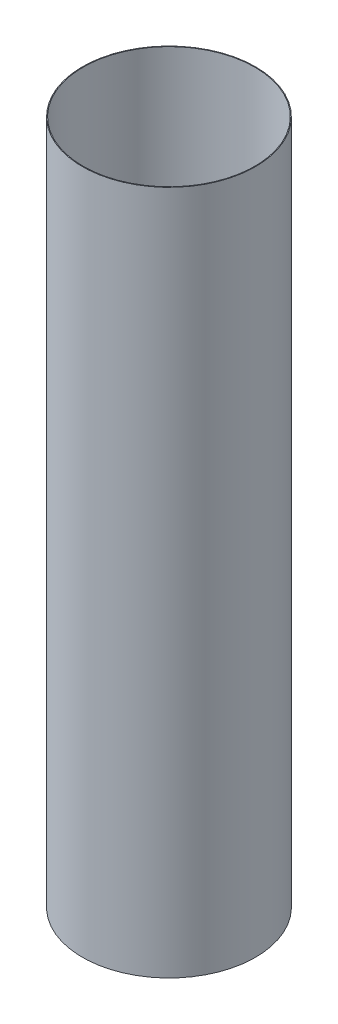
ISO-10303-21;
HEADER;
FILE_DESCRIPTION(('STEP AP214'),'2;1');
FILE_NAME('part.step','',(''),(''),'','','');
FILE_SCHEMA(('AUTOMOTIVE_DESIGN { 1 0 10303 214 1 1 1 1 }'));
ENDSEC;
DATA;
#1=APPLICATION_CONTEXT('core data for automotive mechanical design processes');
#2=APPLICATION_PROTOCOL_DEFINITION('international standard','automotive_design',2000,#1);
#3=PRODUCT_CONTEXT('',#1,'mechanical');
#4=PRODUCT('Part','Part','',(#3));
#5=PRODUCT_RELATED_PRODUCT_CATEGORY('part','',(#4));
#6=PRODUCT_DEFINITION_FORMATION('','',#4);
#7=PRODUCT_DEFINITION_CONTEXT('part definition',#1,'design');
#8=PRODUCT_DEFINITION('design','',#6,#7);
#9=PRODUCT_DEFINITION_SHAPE('','',#8);
#10=(LENGTH_UNIT() NAMED_UNIT(*) SI_UNIT(.MILLI.,.METRE.));
#11=(NAMED_UNIT(*) PLANE_ANGLE_UNIT() SI_UNIT($,.RADIAN.));
#12=(NAMED_UNIT(*) SI_UNIT($,.STERADIAN.) SOLID_ANGLE_UNIT());
#13=UNCERTAINTY_MEASURE_WITH_UNIT(LENGTH_MEASURE(1.E-05),#10,'distance_accuracy_value','');
#14=(GEOMETRIC_REPRESENTATION_CONTEXT(3) GLOBAL_UNCERTAINTY_ASSIGNED_CONTEXT((#13)) GLOBAL_UNIT_ASSIGNED_CONTEXT((#10,
#11,#12)) REPRESENTATION_CONTEXT('',''));
#15=CARTESIAN_POINT('',(0.,0.,0.));
#16=DIRECTION('',(0.,0.,1.));
#17=DIRECTION('',(1.,0.,0.));
#18=AXIS2_PLACEMENT_3D('',#15,#16,#17);
#19=CARTESIAN_POINT('',(11.,0.,0.));
#20=DIRECTION('',(0.,-1.,0.));
#21=DIRECTION('',(0.,0.,-1.));
#22=AXIS2_PLACEMENT_3D('',#19,#20,#21);
#23=CYLINDRICAL_SURFACE('',#22,11.);
#24=CARTESIAN_POINT('',(11.,0.,0.));
#25=DIRECTION('',(0.,-1.,0.));
#26=DIRECTION('',(0.,0.,-1.));
#27=AXIS2_PLACEMENT_3D('',#24,#25,#26);
#28=CIRCLE('',#27,11.);
#29=CARTESIAN_POINT('',(11.,0.,-11.));
#30=VERTEX_POINT('',#29);
#31=EDGE_CURVE('E10',#30,#30,#28,.T.);
#32=ORIENTED_EDGE('',*,*,#31,.F.);
#33=EDGE_LOOP('',(#32));
#34=FACE_BOUND('',#33,.T.);
#35=CARTESIAN_POINT('',(11.,87.,0.));
#36=DIRECTION('',(0.,-1.,0.));
#37=DIRECTION('',(0.,0.,-1.));
#38=AXIS2_PLACEMENT_3D('',#35,#36,#37);
#39=CIRCLE('',#38,11.);
#40=CARTESIAN_POINT('',(11.,87.,-11.));
#41=VERTEX_POINT('',#40);
#42=EDGE_CURVE('E37',#41,#41,#39,.T.);
#43=ORIENTED_EDGE('',*,*,#42,.T.);
#44=EDGE_LOOP('',(#43));
#45=FACE_BOUND('',#44,.T.);
#46=ADVANCED_FACE('F31',(#34,#45),#23,.T.);
#47=CARTESIAN_POINT('',(0.,0.,0.));
#48=DIRECTION('',(0.,1.,0.));
#49=DIRECTION('',(0.,0.,1.));
#50=AXIS2_PLACEMENT_3D('',#47,#48,#49);
#51=PLANE('',#50);
#52=CARTESIAN_POINT('',(11.,0.,0.));
#53=DIRECTION('',(0.,1.,0.));
#54=DIRECTION('',(0.,0.,1.));
#55=AXIS2_PLACEMENT_3D('',#52,#53,#54);
#56=CIRCLE('',#55,10.91);
#57=CARTESIAN_POINT('',(11.,0.,10.91));
#58=VERTEX_POINT('',#57);
#59=EDGE_CURVE('E41',#58,#58,#56,.T.);
#60=ORIENTED_EDGE('',*,*,#59,.T.);
#61=EDGE_LOOP('',(#60));
#62=FACE_BOUND('',#61,.T.);
#63=ORIENTED_EDGE('',*,*,#31,.T.);
#64=EDGE_LOOP('',(#63));
#65=FACE_BOUND('',#64,.T.);
#66=ADVANCED_FACE('F56',(#62,#65),#51,.F.);
#67=CARTESIAN_POINT('',(11.,87.,0.));
#68=DIRECTION('',(0.,-1.,0.));
#69=DIRECTION('',(0.,0.,-1.));
#70=AXIS2_PLACEMENT_3D('',#67,#68,#69);
#71=PLANE('',#70);
#72=CARTESIAN_POINT('',(11.,87.,0.));
#73=DIRECTION('',(0.,1.,0.));
#74=DIRECTION('',(0.,0.,1.));
#75=AXIS2_PLACEMENT_3D('',#72,#73,#74);
#76=CIRCLE('',#75,10.91);
#77=CARTESIAN_POINT('',(11.,87.,10.91));
#78=VERTEX_POINT('',#77);
#79=EDGE_CURVE('E45',#78,#78,#76,.T.);
#80=ORIENTED_EDGE('',*,*,#79,.F.);
#81=EDGE_LOOP('',(#80));
#82=FACE_BOUND('',#81,.T.);
#83=ORIENTED_EDGE('',*,*,#42,.F.);
#84=EDGE_LOOP('',(#83));
#85=FACE_BOUND('',#84,.T.);
#86=ADVANCED_FACE('F53',(#82,#85),#71,.F.);
#87=CARTESIAN_POINT('',(11.,0.,0.));
#88=DIRECTION('',(0.,1.,0.));
#89=DIRECTION('',(0.,0.,1.));
#90=AXIS2_PLACEMENT_3D('',#87,#88,#89);
#91=CYLINDRICAL_SURFACE('',#90,10.91);
#92=ORIENTED_EDGE('',*,*,#59,.F.);
#93=EDGE_LOOP('',(#92));
#94=FACE_BOUND('',#93,.T.);
#95=ORIENTED_EDGE('',*,*,#79,.T.);
#96=EDGE_LOOP('',(#95));
#97=FACE_BOUND('',#96,.T.);
#98=ADVANCED_FACE('F51',(#94,#97),#91,.F.);
#99=CLOSED_SHELL('',(#46,#66,#86,#98));
#100=MANIFOLD_SOLID_BREP('B2',#99);
#101=ADVANCED_BREP_SHAPE_REPRESENTATION('',(#18,#100),#14);
#102=SHAPE_DEFINITION_REPRESENTATION(#9,#101);
ENDSEC;
END-ISO-10303-21;
